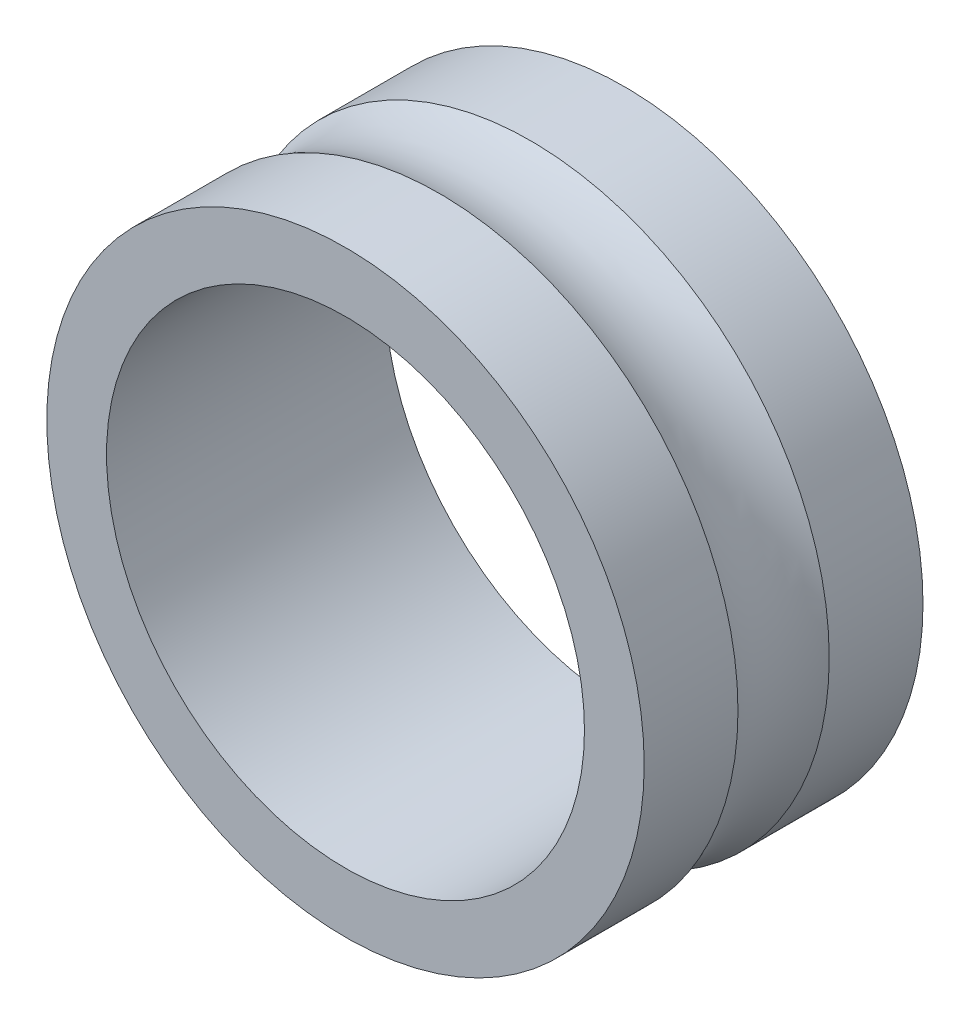
ISO-10303-21;
HEADER;
FILE_DESCRIPTION(('STEP AP214'),'2;1');
FILE_NAME('part.step','',(''),(''),'','','');
FILE_SCHEMA(('AUTOMOTIVE_DESIGN { 1 0 10303 214 1 1 1 1 }'));
ENDSEC;
DATA;
#1=APPLICATION_CONTEXT('core data for automotive mechanical design processes');
#2=APPLICATION_PROTOCOL_DEFINITION('international standard','automotive_design',2000,#1);
#3=PRODUCT_CONTEXT('',#1,'mechanical');
#4=PRODUCT('Part','Part','',(#3));
#5=PRODUCT_RELATED_PRODUCT_CATEGORY('part','',(#4));
#6=PRODUCT_DEFINITION_FORMATION('','',#4);
#7=PRODUCT_DEFINITION_CONTEXT('part definition',#1,'design');
#8=PRODUCT_DEFINITION('design','',#6,#7);
#9=PRODUCT_DEFINITION_SHAPE('','',#8);
#10=(LENGTH_UNIT() NAMED_UNIT(*) SI_UNIT(.MILLI.,.METRE.));
#11=(NAMED_UNIT(*) PLANE_ANGLE_UNIT() SI_UNIT($,.RADIAN.));
#12=(NAMED_UNIT(*) SI_UNIT($,.STERADIAN.) SOLID_ANGLE_UNIT());
#13=UNCERTAINTY_MEASURE_WITH_UNIT(LENGTH_MEASURE(1.E-05),#10,'distance_accuracy_value','');
#14=(GEOMETRIC_REPRESENTATION_CONTEXT(3) GLOBAL_UNCERTAINTY_ASSIGNED_CONTEXT((#13)) GLOBAL_UNIT_ASSIGNED_CONTEXT((#10,
#11,#12)) REPRESENTATION_CONTEXT('',''));
#15=CARTESIAN_POINT('',(0.,0.,0.));
#16=DIRECTION('',(0.,0.,1.));
#17=DIRECTION('',(1.,0.,0.));
#18=AXIS2_PLACEMENT_3D('',#15,#16,#17);
#19=CARTESIAN_POINT('',(0.,0.,0.));
#20=DIRECTION('',(0.,0.,1.));
#21=DIRECTION('',(1.,0.,0.));
#22=AXIS2_PLACEMENT_3D('',#19,#20,#21);
#23=TOROIDAL_SURFACE('',#22,20.,5.5);
#24=CARTESIAN_POINT('',(0.,0.,2.29128784747792));
#25=DIRECTION('',(0.,0.,1.));
#26=DIRECTION('',(1.,0.,0.));
#27=AXIS2_PLACEMENT_3D('',#24,#25,#26);
#28=CIRCLE('',#27,15.);
#29=CARTESIAN_POINT('',(15.,0.,2.29128784747792));
#30=VERTEX_POINT('',#29);
#31=EDGE_CURVE('E31',#30,#30,#28,.T.);
#32=ORIENTED_EDGE('',*,*,#31,.F.);
#33=EDGE_LOOP('',(#32));
#34=FACE_BOUND('',#33,.T.);
#35=CARTESIAN_POINT('',(0.,0.,-2.29128784747792));
#36=DIRECTION('',(0.,0.,1.));
#37=DIRECTION('',(1.,0.,0.));
#38=AXIS2_PLACEMENT_3D('',#35,#36,#37);
#39=CIRCLE('',#38,15.);
#40=CARTESIAN_POINT('',(15.,0.,-2.29128784747792));
#41=VERTEX_POINT('',#40);
#42=EDGE_CURVE('E36',#41,#41,#39,.F.);
#43=ORIENTED_EDGE('',*,*,#42,.F.);
#44=EDGE_LOOP('',(#43));
#45=FACE_BOUND('',#44,.T.);
#46=ADVANCED_FACE('F15',(#34,#45),#23,.F.);
#47=CARTESIAN_POINT('',(0.,0.,-7.));
#48=DIRECTION('',(0.,0.,1.));
#49=DIRECTION('',(1.,0.,0.));
#50=AXIS2_PLACEMENT_3D('',#47,#48,#49);
#51=CYLINDRICAL_SURFACE('',#50,15.);
#52=ORIENTED_EDGE('',*,*,#31,.T.);
#53=EDGE_LOOP('',(#52));
#54=FACE_BOUND('',#53,.T.);
#55=CARTESIAN_POINT('',(0.,0.,7.));
#56=DIRECTION('',(0.,0.,1.));
#57=DIRECTION('',(1.,0.,0.));
#58=AXIS2_PLACEMENT_3D('',#55,#56,#57);
#59=CIRCLE('',#58,15.);
#60=CARTESIAN_POINT('',(15.,0.,7.));
#61=VERTEX_POINT('',#60);
#62=EDGE_CURVE('E19',#61,#61,#59,.T.);
#63=ORIENTED_EDGE('',*,*,#62,.F.);
#64=EDGE_LOOP('',(#63));
#65=FACE_BOUND('',#64,.T.);
#66=ADVANCED_FACE('F47',(#54,#65),#51,.T.);
#67=CARTESIAN_POINT('',(0.,0.,-7.));
#68=DIRECTION('',(0.,0.,1.));
#69=DIRECTION('',(1.,0.,0.));
#70=AXIS2_PLACEMENT_3D('',#67,#68,#69);
#71=CYLINDRICAL_SURFACE('',#70,15.);
#72=ORIENTED_EDGE('',*,*,#42,.T.);
#73=EDGE_LOOP('',(#72));
#74=FACE_BOUND('',#73,.T.);
#75=CARTESIAN_POINT('',(0.,0.,-7.));
#76=DIRECTION('',(0.,0.,1.));
#77=DIRECTION('',(1.,0.,0.));
#78=AXIS2_PLACEMENT_3D('',#75,#76,#77);
#79=CIRCLE('',#78,15.);
#80=CARTESIAN_POINT('',(15.,0.,-7.));
#81=VERTEX_POINT('',#80);
#82=EDGE_CURVE('E28',#81,#81,#79,.T.);
#83=ORIENTED_EDGE('',*,*,#82,.T.);
#84=EDGE_LOOP('',(#83));
#85=FACE_BOUND('',#84,.T.);
#86=ADVANCED_FACE('F56',(#74,#85),#71,.T.);
#87=CARTESIAN_POINT('',(0.,0.,7.));
#88=DIRECTION('',(0.,0.,1.));
#89=DIRECTION('',(1.,0.,0.));
#90=AXIS2_PLACEMENT_3D('',#87,#88,#89);
#91=PLANE('',#90);
#92=CARTESIAN_POINT('',(0.,0.,7.));
#93=DIRECTION('',(0.,0.,1.));
#94=DIRECTION('',(1.,0.,0.));
#95=AXIS2_PLACEMENT_3D('',#92,#93,#94);
#96=CIRCLE('',#95,12.);
#97=CARTESIAN_POINT('',(12.,0.,7.));
#98=VERTEX_POINT('',#97);
#99=EDGE_CURVE('E23',#98,#98,#96,.F.);
#100=ORIENTED_EDGE('',*,*,#99,.T.);
#101=EDGE_LOOP('',(#100));
#102=FACE_BOUND('',#101,.T.);
#103=ORIENTED_EDGE('',*,*,#62,.T.);
#104=EDGE_LOOP('',(#103));
#105=FACE_BOUND('',#104,.T.);
#106=ADVANCED_FACE('F65',(#102,#105),#91,.T.);
#107=CARTESIAN_POINT('',(0.,0.,-7.));
#108=DIRECTION('',(0.,0.,1.));
#109=DIRECTION('',(1.,0.,0.));
#110=AXIS2_PLACEMENT_3D('',#107,#108,#109);
#111=PLANE('',#110);
#112=ORIENTED_EDGE('',*,*,#82,.F.);
#113=EDGE_LOOP('',(#112));
#114=FACE_BOUND('',#113,.T.);
#115=CARTESIAN_POINT('',(0.,0.,-7.));
#116=DIRECTION('',(0.,0.,1.));
#117=DIRECTION('',(1.,0.,0.));
#118=AXIS2_PLACEMENT_3D('',#115,#116,#117);
#119=CIRCLE('',#118,12.);
#120=CARTESIAN_POINT('',(12.,0.,-7.));
#121=VERTEX_POINT('',#120);
#122=EDGE_CURVE('E10',#121,#121,#119,.T.);
#123=ORIENTED_EDGE('',*,*,#122,.T.);
#124=EDGE_LOOP('',(#123));
#125=FACE_BOUND('',#124,.T.);
#126=ADVANCED_FACE('F59',(#114,#125),#111,.F.);
#127=CARTESIAN_POINT('',(0.,0.,-7.));
#128=DIRECTION('',(0.,0.,1.));
#129=DIRECTION('',(1.,0.,0.));
#130=AXIS2_PLACEMENT_3D('',#127,#128,#129);
#131=CYLINDRICAL_SURFACE('',#130,12.);
#132=ORIENTED_EDGE('',*,*,#99,.F.);
#133=EDGE_LOOP('',(#132));
#134=FACE_BOUND('',#133,.T.);
#135=ORIENTED_EDGE('',*,*,#122,.F.);
#136=EDGE_LOOP('',(#135));
#137=FACE_BOUND('',#136,.T.);
#138=ADVANCED_FACE('F57',(#134,#137),#131,.F.);
#139=CLOSED_SHELL('',(#46,#66,#86,#106,#126,#138));
#140=MANIFOLD_SOLID_BREP('B1',#139);
#141=ADVANCED_BREP_SHAPE_REPRESENTATION('',(#18,#140),#14);
#142=SHAPE_DEFINITION_REPRESENTATION(#9,#141);
ENDSEC;
END-ISO-10303-21;
